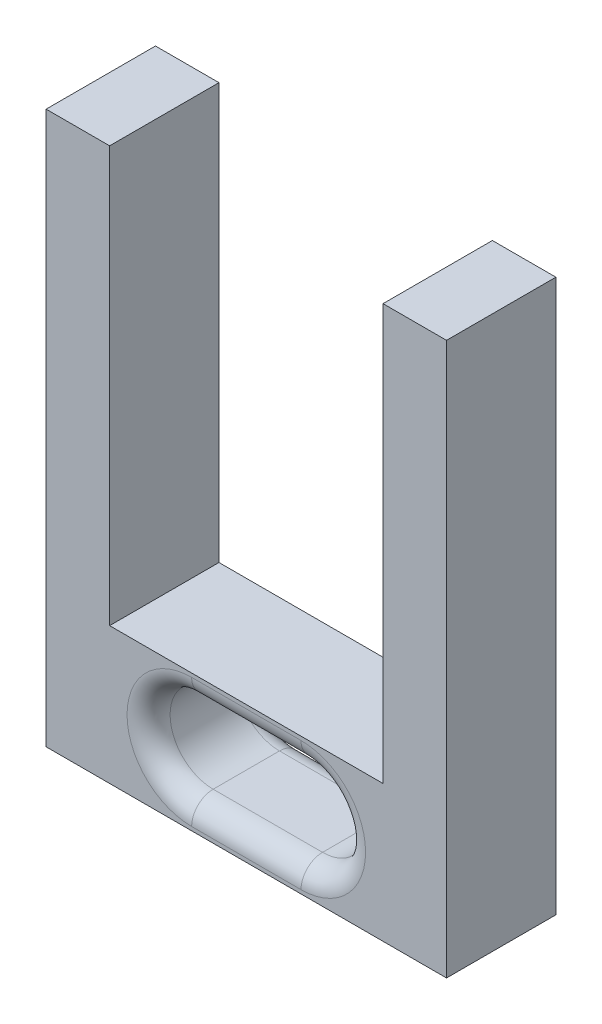
ISO-10303-21;
HEADER;
FILE_DESCRIPTION(('STEP AP214'),'2;1');
FILE_NAME('part.step','',(''),(''),'','','');
FILE_SCHEMA(('AUTOMOTIVE_DESIGN { 1 0 10303 214 1 1 1 1 }'));
ENDSEC;
DATA;
#1=APPLICATION_CONTEXT('core data for automotive mechanical design processes');
#2=APPLICATION_PROTOCOL_DEFINITION('international standard','automotive_design',2000,#1);
#3=PRODUCT_CONTEXT('',#1,'mechanical');
#4=PRODUCT('Part','Part','',(#3));
#5=PRODUCT_RELATED_PRODUCT_CATEGORY('part','',(#4));
#6=PRODUCT_DEFINITION_FORMATION('','',#4);
#7=PRODUCT_DEFINITION_CONTEXT('part definition',#1,'design');
#8=PRODUCT_DEFINITION('design','',#6,#7);
#9=PRODUCT_DEFINITION_SHAPE('','',#8);
#10=(LENGTH_UNIT() NAMED_UNIT(*) SI_UNIT(.MILLI.,.METRE.));
#11=(NAMED_UNIT(*) PLANE_ANGLE_UNIT() SI_UNIT($,.RADIAN.));
#12=(NAMED_UNIT(*) SI_UNIT($,.STERADIAN.) SOLID_ANGLE_UNIT());
#13=UNCERTAINTY_MEASURE_WITH_UNIT(LENGTH_MEASURE(1.E-05),#10,'distance_accuracy_value','');
#14=(GEOMETRIC_REPRESENTATION_CONTEXT(3) GLOBAL_UNCERTAINTY_ASSIGNED_CONTEXT((#13)) GLOBAL_UNIT_ASSIGNED_CONTEXT((#10,
#11,#12)) REPRESENTATION_CONTEXT('',''));
#15=CARTESIAN_POINT('',(0.,0.,0.));
#16=DIRECTION('',(0.,0.,1.));
#17=DIRECTION('',(1.,0.,0.));
#18=AXIS2_PLACEMENT_3D('',#15,#16,#17);
#19=CARTESIAN_POINT('',(0.,0.,25.4));
#20=DIRECTION('',(0.,0.,1.));
#21=DIRECTION('',(1.,0.,0.));
#22=AXIS2_PLACEMENT_3D('',#19,#20,#21);
#23=PLANE('',#22);
#24=DIRECTION('',(1.,0.,0.));
#25=VECTOR('',#24,1.);
#26=CARTESIAN_POINT('',(0.,-127.395,25.4));
#27=LINE('',#26,#25);
#28=CARTESIAN_POINT('',(12.7,-127.395,25.4));
#29=VERTEX_POINT('',#28);
#30=CARTESIAN_POINT('',(-12.7,-127.395,25.4));
#31=VERTEX_POINT('',#30);
#32=EDGE_CURVE('E201',#29,#31,#27,.F.);
#33=ORIENTED_EDGE('',*,*,#32,.T.);
#34=CARTESIAN_POINT('',(-12.7,-112.395,25.4));
#35=DIRECTION('',(0.,0.,1.));
#36=DIRECTION('',(1.,0.,0.));
#37=AXIS2_PLACEMENT_3D('',#34,#35,#36);
#38=CIRCLE('',#37,15.);
#39=CARTESIAN_POINT('',(-12.7,-97.395,25.4));
#40=VERTEX_POINT('',#39);
#41=EDGE_CURVE('E206',#31,#40,#38,.F.);
#42=ORIENTED_EDGE('',*,*,#41,.T.);
#43=DIRECTION('',(-1.,0.,0.));
#44=VECTOR('',#43,1.);
#45=CARTESIAN_POINT('',(0.,-97.395,25.4));
#46=LINE('',#45,#44);
#47=CARTESIAN_POINT('',(12.7,-97.395,25.4));
#48=VERTEX_POINT('',#47);
#49=EDGE_CURVE('E57',#40,#48,#46,.F.);
#50=ORIENTED_EDGE('',*,*,#49,.T.);
#51=CARTESIAN_POINT('',(12.7,-112.395,25.4));
#52=DIRECTION('',(0.,0.,1.));
#53=DIRECTION('',(1.,0.,0.));
#54=AXIS2_PLACEMENT_3D('',#51,#52,#53);
#55=CIRCLE('',#54,15.);
#56=EDGE_CURVE('E203',#48,#29,#55,.F.);
#57=ORIENTED_EDGE('',*,*,#56,.T.);
#58=EDGE_LOOP('',(#33,#42,#50,#57));
#59=FACE_BOUND('',#58,.T.);
#60=DIRECTION('',(0.,-1.,0.));
#61=VECTOR('',#60,1.);
#62=CARTESIAN_POINT('',(-46.5,0.,25.4));
#63=LINE('',#62,#61);
#64=CARTESIAN_POINT('',(-46.5,0.,25.4));
#65=VERTEX_POINT('',#64);
#66=CARTESIAN_POINT('',(-46.5,-128.27,25.4));
#67=VERTEX_POINT('',#66);
#68=EDGE_CURVE('E160',#65,#67,#63,.T.);
#69=ORIENTED_EDGE('',*,*,#68,.T.);
#70=DIRECTION('',(1.,0.,0.));
#71=VECTOR('',#70,1.);
#72=CARTESIAN_POINT('',(-46.5,-128.27,25.4));
#73=LINE('',#72,#71);
#74=CARTESIAN_POINT('',(46.5,-128.27,25.4));
#75=VERTEX_POINT('',#74);
#76=EDGE_CURVE('E149',#67,#75,#73,.T.);
#77=ORIENTED_EDGE('',*,*,#76,.T.);
#78=DIRECTION('',(0.,1.,0.));
#79=VECTOR('',#78,1.);
#80=CARTESIAN_POINT('',(46.5,-128.27,25.4));
#81=LINE('',#80,#79);
#82=CARTESIAN_POINT('',(46.5,0.,25.4));
#83=VERTEX_POINT('',#82);
#84=EDGE_CURVE('E159',#75,#83,#81,.T.);
#85=ORIENTED_EDGE('',*,*,#84,.T.);
#86=DIRECTION('',(-1.,0.,0.));
#87=VECTOR('',#86,1.);
#88=CARTESIAN_POINT('',(46.5,0.,25.4));
#89=LINE('',#88,#87);
#90=CARTESIAN_POINT('',(31.75,0.,25.4));
#91=VERTEX_POINT('',#90);
#92=EDGE_CURVE('E260',#83,#91,#89,.T.);
#93=ORIENTED_EDGE('',*,*,#92,.T.);
#94=DIRECTION('',(0.,-1.,0.));
#95=VECTOR('',#94,1.);
#96=CARTESIAN_POINT('',(31.75,-96.52,25.4));
#97=LINE('',#96,#95);
#98=CARTESIAN_POINT('',(31.75,-96.52,25.4));
#99=VERTEX_POINT('',#98);
#100=EDGE_CURVE('E262',#91,#99,#97,.T.);
#101=ORIENTED_EDGE('',*,*,#100,.T.);
#102=DIRECTION('',(-1.,0.,0.));
#103=VECTOR('',#102,1.);
#104=CARTESIAN_POINT('',(-31.75,-96.52,25.4));
#105=LINE('',#104,#103);
#106=CARTESIAN_POINT('',(-31.75,-96.52,25.4));
#107=VERTEX_POINT('',#106);
#108=EDGE_CURVE('E264',#99,#107,#105,.T.);
#109=ORIENTED_EDGE('',*,*,#108,.T.);
#110=DIRECTION('',(0.,1.,0.));
#111=VECTOR('',#110,1.);
#112=CARTESIAN_POINT('',(-31.75,0.,25.4));
#113=LINE('',#112,#111);
#114=CARTESIAN_POINT('',(-31.75,0.,25.4));
#115=VERTEX_POINT('',#114);
#116=EDGE_CURVE('E266',#107,#115,#113,.T.);
#117=ORIENTED_EDGE('',*,*,#116,.T.);
#118=DIRECTION('',(-1.,0.,0.));
#119=VECTOR('',#118,1.);
#120=CARTESIAN_POINT('',(-46.5,0.,25.4));
#121=LINE('',#120,#119);
#122=EDGE_CURVE('E164',#115,#65,#121,.T.);
#123=ORIENTED_EDGE('',*,*,#122,.T.);
#124=EDGE_LOOP('',(#69,#77,#85,#93,#101,#109,#117,#123));
#125=FACE_BOUND('',#124,.T.);
#126=ADVANCED_FACE('F33',(#59,#125),#23,.T.);
#127=CARTESIAN_POINT('',(0.,0.,0.));
#128=DIRECTION('',(0.,0.,1.));
#129=DIRECTION('',(1.,0.,0.));
#130=AXIS2_PLACEMENT_3D('',#127,#128,#129);
#131=PLANE('',#130);
#132=DIRECTION('',(1.,0.,0.));
#133=VECTOR('',#132,1.);
#134=CARTESIAN_POINT('',(12.7,-127.395,0.));
#135=LINE('',#134,#133);
#136=CARTESIAN_POINT('',(-12.7,-127.395,0.));
#137=VERTEX_POINT('',#136);
#138=CARTESIAN_POINT('',(12.7,-127.395,0.));
#139=VERTEX_POINT('',#138);
#140=EDGE_CURVE('E182',#137,#139,#135,.T.);
#141=ORIENTED_EDGE('',*,*,#140,.T.);
#142=CARTESIAN_POINT('',(12.7,-112.395,0.));
#143=DIRECTION('',(0.,0.,1.));
#144=DIRECTION('',(1.,0.,0.));
#145=AXIS2_PLACEMENT_3D('',#142,#143,#144);
#146=CIRCLE('',#145,15.);
#147=CARTESIAN_POINT('',(12.7,-97.395,0.));
#148=VERTEX_POINT('',#147);
#149=EDGE_CURVE('E184',#139,#148,#146,.T.);
#150=ORIENTED_EDGE('',*,*,#149,.T.);
#151=DIRECTION('',(-1.,0.,0.));
#152=VECTOR('',#151,1.);
#153=CARTESIAN_POINT('',(-12.7,-97.395,0.));
#154=LINE('',#153,#152);
#155=CARTESIAN_POINT('',(-12.7,-97.395,0.));
#156=VERTEX_POINT('',#155);
#157=EDGE_CURVE('E173',#148,#156,#154,.T.);
#158=ORIENTED_EDGE('',*,*,#157,.T.);
#159=CARTESIAN_POINT('',(-12.7,-112.395,0.));
#160=DIRECTION('',(0.,0.,1.));
#161=DIRECTION('',(1.,0.,0.));
#162=AXIS2_PLACEMENT_3D('',#159,#160,#161);
#163=CIRCLE('',#162,15.);
#164=EDGE_CURVE('E175',#156,#137,#163,.T.);
#165=ORIENTED_EDGE('',*,*,#164,.T.);
#166=EDGE_LOOP('',(#141,#150,#158,#165));
#167=FACE_BOUND('',#166,.T.);
#168=DIRECTION('',(0.,-1.,0.));
#169=VECTOR('',#168,1.);
#170=CARTESIAN_POINT('',(-46.5,0.,0.));
#171=LINE('',#170,#169);
#172=CARTESIAN_POINT('',(-46.5,0.,0.));
#173=VERTEX_POINT('',#172);
#174=CARTESIAN_POINT('',(-46.5,-128.27,0.));
#175=VERTEX_POINT('',#174);
#176=EDGE_CURVE('E172',#173,#175,#171,.T.);
#177=ORIENTED_EDGE('',*,*,#176,.F.);
#178=DIRECTION('',(-1.,0.,0.));
#179=VECTOR('',#178,1.);
#180=CARTESIAN_POINT('',(-46.5,0.,0.));
#181=LINE('',#180,#179);
#182=CARTESIAN_POINT('',(-31.75,0.,0.));
#183=VERTEX_POINT('',#182);
#184=EDGE_CURVE('E168',#183,#173,#181,.T.);
#185=ORIENTED_EDGE('',*,*,#184,.F.);
#186=DIRECTION('',(0.,1.,0.));
#187=VECTOR('',#186,1.);
#188=CARTESIAN_POINT('',(-31.75,0.,0.));
#189=LINE('',#188,#187);
#190=CARTESIAN_POINT('',(-31.75,-96.52,0.));
#191=VERTEX_POINT('',#190);
#192=EDGE_CURVE('E279',#191,#183,#189,.T.);
#193=ORIENTED_EDGE('',*,*,#192,.F.);
#194=DIRECTION('',(-1.,0.,0.));
#195=VECTOR('',#194,1.);
#196=CARTESIAN_POINT('',(-31.75,-96.52,0.));
#197=LINE('',#196,#195);
#198=CARTESIAN_POINT('',(31.75,-96.52,0.));
#199=VERTEX_POINT('',#198);
#200=EDGE_CURVE('E277',#199,#191,#197,.T.);
#201=ORIENTED_EDGE('',*,*,#200,.F.);
#202=DIRECTION('',(0.,-1.,0.));
#203=VECTOR('',#202,1.);
#204=CARTESIAN_POINT('',(31.75,-96.52,0.));
#205=LINE('',#204,#203);
#206=CARTESIAN_POINT('',(31.75,0.,0.));
#207=VERTEX_POINT('',#206);
#208=EDGE_CURVE('E275',#207,#199,#205,.T.);
#209=ORIENTED_EDGE('',*,*,#208,.F.);
#210=DIRECTION('',(-1.,0.,0.));
#211=VECTOR('',#210,1.);
#212=CARTESIAN_POINT('',(46.5,0.,0.));
#213=LINE('',#212,#211);
#214=CARTESIAN_POINT('',(46.5,0.,0.));
#215=VERTEX_POINT('',#214);
#216=EDGE_CURVE('E273',#215,#207,#213,.T.);
#217=ORIENTED_EDGE('',*,*,#216,.F.);
#218=DIRECTION('',(0.,1.,0.));
#219=VECTOR('',#218,1.);
#220=CARTESIAN_POINT('',(46.5,-128.27,0.));
#221=LINE('',#220,#219);
#222=CARTESIAN_POINT('',(46.5,-128.27,0.));
#223=VERTEX_POINT('',#222);
#224=EDGE_CURVE('E271',#223,#215,#221,.T.);
#225=ORIENTED_EDGE('',*,*,#224,.F.);
#226=DIRECTION('',(1.,0.,0.));
#227=VECTOR('',#226,1.);
#228=CARTESIAN_POINT('',(-46.5,-128.27,0.));
#229=LINE('',#228,#227);
#230=EDGE_CURVE('E253',#175,#223,#229,.T.);
#231=ORIENTED_EDGE('',*,*,#230,.F.);
#232=EDGE_LOOP('',(#177,#185,#193,#201,#209,#217,#225,#231));
#233=FACE_BOUND('',#232,.T.);
#234=ADVANCED_FACE('F305',(#167,#233),#131,.F.);
#235=CARTESIAN_POINT('',(-46.5,0.,25.4));
#236=DIRECTION('',(1.,0.,0.));
#237=DIRECTION('',(0.,1.,0.));
#238=AXIS2_PLACEMENT_3D('',#235,#236,#237);
#239=PLANE('',#238);
#240=ORIENTED_EDGE('',*,*,#176,.T.);
#241=DIRECTION('',(0.,0.,-1.));
#242=VECTOR('',#241,1.);
#243=CARTESIAN_POINT('',(-46.5,-128.27,25.4));
#244=LINE('',#243,#242);
#245=EDGE_CURVE('E153',#67,#175,#244,.T.);
#246=ORIENTED_EDGE('',*,*,#245,.F.);
#247=ORIENTED_EDGE('',*,*,#68,.F.);
#248=DIRECTION('',(0.,0.,-1.));
#249=VECTOR('',#248,1.);
#250=CARTESIAN_POINT('',(-46.5,0.,25.4));
#251=LINE('',#250,#249);
#252=EDGE_CURVE('E268',#65,#173,#251,.T.);
#253=ORIENTED_EDGE('',*,*,#252,.T.);
#254=EDGE_LOOP('',(#240,#246,#247,#253));
#255=FACE_BOUND('',#254,.T.);
#256=ADVANCED_FACE('F170',(#255),#239,.F.);
#257=CARTESIAN_POINT('',(-46.5,-128.27,25.4));
#258=DIRECTION('',(0.,1.,0.));
#259=DIRECTION('',(-1.,0.,0.));
#260=AXIS2_PLACEMENT_3D('',#257,#258,#259);
#261=PLANE('',#260);
#262=ORIENTED_EDGE('',*,*,#230,.T.);
#263=DIRECTION('',(0.,0.,-1.));
#264=VECTOR('',#263,1.);
#265=CARTESIAN_POINT('',(46.5,-128.27,25.4));
#266=LINE('',#265,#264);
#267=EDGE_CURVE('E156',#75,#223,#266,.T.);
#268=ORIENTED_EDGE('',*,*,#267,.F.);
#269=ORIENTED_EDGE('',*,*,#76,.F.);
#270=ORIENTED_EDGE('',*,*,#245,.T.);
#271=EDGE_LOOP('',(#262,#268,#269,#270));
#272=FACE_BOUND('',#271,.T.);
#273=ADVANCED_FACE('F151',(#272),#261,.F.);
#274=CARTESIAN_POINT('',(46.5,-128.27,25.4));
#275=DIRECTION('',(-1.,0.,0.));
#276=DIRECTION('',(0.,-1.,0.));
#277=AXIS2_PLACEMENT_3D('',#274,#275,#276);
#278=PLANE('',#277);
#279=ORIENTED_EDGE('',*,*,#224,.T.);
#280=DIRECTION('',(0.,0.,-1.));
#281=VECTOR('',#280,1.);
#282=CARTESIAN_POINT('',(46.5,0.,25.4));
#283=LINE('',#282,#281);
#284=EDGE_CURVE('E177',#83,#215,#283,.T.);
#285=ORIENTED_EDGE('',*,*,#284,.F.);
#286=ORIENTED_EDGE('',*,*,#84,.F.);
#287=ORIENTED_EDGE('',*,*,#267,.T.);
#288=EDGE_LOOP('',(#279,#285,#286,#287));
#289=FACE_BOUND('',#288,.T.);
#290=ADVANCED_FACE('F318',(#289),#278,.F.);
#291=CARTESIAN_POINT('',(46.5,0.,25.4));
#292=DIRECTION('',(0.,-1.,0.));
#293=DIRECTION('',(1.,0.,0.));
#294=AXIS2_PLACEMENT_3D('',#291,#292,#293);
#295=PLANE('',#294);
#296=ORIENTED_EDGE('',*,*,#216,.T.);
#297=DIRECTION('',(0.,0.,-1.));
#298=VECTOR('',#297,1.);
#299=CARTESIAN_POINT('',(31.75,0.,25.4));
#300=LINE('',#299,#298);
#301=EDGE_CURVE('E292',#91,#207,#300,.T.);
#302=ORIENTED_EDGE('',*,*,#301,.F.);
#303=ORIENTED_EDGE('',*,*,#92,.F.);
#304=ORIENTED_EDGE('',*,*,#284,.T.);
#305=EDGE_LOOP('',(#296,#302,#303,#304));
#306=FACE_BOUND('',#305,.T.);
#307=ADVANCED_FACE('F299',(#306),#295,.F.);
#308=CARTESIAN_POINT('',(31.75,-96.52,25.4));
#309=DIRECTION('',(1.,0.,0.));
#310=DIRECTION('',(0.,1.,0.));
#311=AXIS2_PLACEMENT_3D('',#308,#309,#310);
#312=PLANE('',#311);
#313=ORIENTED_EDGE('',*,*,#208,.T.);
#314=DIRECTION('',(0.,0.,-1.));
#315=VECTOR('',#314,1.);
#316=CARTESIAN_POINT('',(31.75,-96.52,25.4));
#317=LINE('',#316,#315);
#318=EDGE_CURVE('E289',#99,#199,#317,.T.);
#319=ORIENTED_EDGE('',*,*,#318,.F.);
#320=ORIENTED_EDGE('',*,*,#100,.F.);
#321=ORIENTED_EDGE('',*,*,#301,.T.);
#322=EDGE_LOOP('',(#313,#319,#320,#321));
#323=FACE_BOUND('',#322,.T.);
#324=ADVANCED_FACE('F310',(#323),#312,.F.);
#325=CARTESIAN_POINT('',(-31.75,-96.52,25.4));
#326=DIRECTION('',(0.,-1.,0.));
#327=DIRECTION('',(1.,0.,0.));
#328=AXIS2_PLACEMENT_3D('',#325,#326,#327);
#329=PLANE('',#328);
#330=ORIENTED_EDGE('',*,*,#200,.T.);
#331=DIRECTION('',(0.,0.,-1.));
#332=VECTOR('',#331,1.);
#333=CARTESIAN_POINT('',(-31.75,-96.52,25.4));
#334=LINE('',#333,#332);
#335=EDGE_CURVE('E286',#107,#191,#334,.T.);
#336=ORIENTED_EDGE('',*,*,#335,.F.);
#337=ORIENTED_EDGE('',*,*,#108,.F.);
#338=ORIENTED_EDGE('',*,*,#318,.T.);
#339=EDGE_LOOP('',(#330,#336,#337,#338));
#340=FACE_BOUND('',#339,.T.);
#341=ADVANCED_FACE('F314',(#340),#329,.F.);
#342=CARTESIAN_POINT('',(-31.75,0.,25.4));
#343=DIRECTION('',(-1.,0.,0.));
#344=DIRECTION('',(0.,-1.,0.));
#345=AXIS2_PLACEMENT_3D('',#342,#343,#344);
#346=PLANE('',#345);
#347=ORIENTED_EDGE('',*,*,#192,.T.);
#348=DIRECTION('',(0.,0.,-1.));
#349=VECTOR('',#348,1.);
#350=CARTESIAN_POINT('',(-31.75,0.,25.4));
#351=LINE('',#350,#349);
#352=EDGE_CURVE('E283',#115,#183,#351,.T.);
#353=ORIENTED_EDGE('',*,*,#352,.F.);
#354=ORIENTED_EDGE('',*,*,#116,.F.);
#355=ORIENTED_EDGE('',*,*,#335,.T.);
#356=EDGE_LOOP('',(#347,#353,#354,#355));
#357=FACE_BOUND('',#356,.T.);
#358=ADVANCED_FACE('F340',(#357),#346,.F.);
#359=CARTESIAN_POINT('',(-46.5,0.,25.4));
#360=DIRECTION('',(0.,-1.,0.));
#361=DIRECTION('',(1.,0.,0.));
#362=AXIS2_PLACEMENT_3D('',#359,#360,#361);
#363=PLANE('',#362);
#364=ORIENTED_EDGE('',*,*,#184,.T.);
#365=ORIENTED_EDGE('',*,*,#252,.F.);
#366=ORIENTED_EDGE('',*,*,#122,.F.);
#367=ORIENTED_EDGE('',*,*,#352,.T.);
#368=EDGE_LOOP('',(#364,#365,#366,#367));
#369=FACE_BOUND('',#368,.T.);
#370=ADVANCED_FACE('F337',(#369),#363,.F.);
#371=CARTESIAN_POINT('',(-12.7,-112.395,25.4));
#372=DIRECTION('',(0.,0.,-1.));
#373=DIRECTION('',(-1.,0.,0.));
#374=AXIS2_PLACEMENT_3D('',#371,#372,#373);
#375=CYLINDRICAL_SURFACE('',#374,9.99999999999999);
#376=DIRECTION('',(0.,0.,-1.));
#377=VECTOR('',#376,1.);
#378=CARTESIAN_POINT('',(-12.7,-122.395,25.4));
#379=LINE('',#378,#377);
#380=CARTESIAN_POINT('',(-12.7,-122.395,20.4));
#381=VERTEX_POINT('',#380);
#382=CARTESIAN_POINT('',(-12.7,-122.395,5.));
#383=VERTEX_POINT('',#382);
#384=EDGE_CURVE('E246',#381,#383,#379,.T.);
#385=ORIENTED_EDGE('',*,*,#384,.T.);
#386=CARTESIAN_POINT('',(-12.7,-112.395,5.));
#387=DIRECTION('',(0.,0.,1.));
#388=DIRECTION('',(1.,0.,0.));
#389=AXIS2_PLACEMENT_3D('',#386,#387,#388);
#390=CIRCLE('',#389,9.99999999999999);
#391=CARTESIAN_POINT('',(-12.7,-102.395,5.));
#392=VERTEX_POINT('',#391);
#393=EDGE_CURVE('E199',#383,#392,#390,.F.);
#394=ORIENTED_EDGE('',*,*,#393,.T.);
#395=DIRECTION('',(0.,0.,-1.));
#396=VECTOR('',#395,1.);
#397=CARTESIAN_POINT('',(-12.7,-102.395,25.4));
#398=LINE('',#397,#396);
#399=CARTESIAN_POINT('',(-12.7,-102.395,20.4));
#400=VERTEX_POINT('',#399);
#401=EDGE_CURVE('E219',#400,#392,#398,.T.);
#402=ORIENTED_EDGE('',*,*,#401,.F.);
#403=CARTESIAN_POINT('',(-12.7,-112.395,20.4));
#404=DIRECTION('',(0.,0.,1.));
#405=DIRECTION('',(1.,0.,0.));
#406=AXIS2_PLACEMENT_3D('',#403,#404,#405);
#407=CIRCLE('',#406,9.99999999999999);
#408=EDGE_CURVE('E196',#400,#381,#407,.T.);
#409=ORIENTED_EDGE('',*,*,#408,.T.);
#410=EDGE_LOOP('',(#385,#394,#402,#409));
#411=FACE_BOUND('',#410,.T.);
#412=ADVANCED_FACE('F245',(#411),#375,.F.);
#413=CARTESIAN_POINT('',(-12.7,-122.395,25.4));
#414=DIRECTION('',(0.,1.,0.));
#415=DIRECTION('',(0.,0.,1.));
#416=AXIS2_PLACEMENT_3D('',#413,#414,#415);
#417=PLANE('',#416);
#418=DIRECTION('',(0.,0.,-1.));
#419=VECTOR('',#418,1.);
#420=CARTESIAN_POINT('',(12.7,-122.395,25.4));
#421=LINE('',#420,#419);
#422=CARTESIAN_POINT('',(12.7,-122.395,20.4));
#423=VERTEX_POINT('',#422);
#424=CARTESIAN_POINT('',(12.7,-122.395,5.));
#425=VERTEX_POINT('',#424);
#426=EDGE_CURVE('E251',#423,#425,#421,.T.);
#427=ORIENTED_EDGE('',*,*,#426,.T.);
#428=DIRECTION('',(1.,0.,0.));
#429=VECTOR('',#428,1.);
#430=CARTESIAN_POINT('',(-12.7,-122.395,5.));
#431=LINE('',#430,#429);
#432=EDGE_CURVE('E194',#425,#383,#431,.F.);
#433=ORIENTED_EDGE('',*,*,#432,.T.);
#434=ORIENTED_EDGE('',*,*,#384,.F.);
#435=DIRECTION('',(1.,0.,0.));
#436=VECTOR('',#435,1.);
#437=CARTESIAN_POINT('',(-12.7,-122.395,20.4));
#438=LINE('',#437,#436);
#439=EDGE_CURVE('E192',#381,#423,#438,.T.);
#440=ORIENTED_EDGE('',*,*,#439,.T.);
#441=EDGE_LOOP('',(#427,#433,#434,#440));
#442=FACE_BOUND('',#441,.T.);
#443=ADVANCED_FACE('F249',(#442),#417,.T.);
#444=CARTESIAN_POINT('',(12.7,-112.395,25.4));
#445=DIRECTION('',(0.,0.,-1.));
#446=DIRECTION('',(-1.,0.,0.));
#447=AXIS2_PLACEMENT_3D('',#444,#445,#446);
#448=CYLINDRICAL_SURFACE('',#447,9.99999999999999);
#449=DIRECTION('',(0.,0.,-1.));
#450=VECTOR('',#449,1.);
#451=CARTESIAN_POINT('',(12.7,-102.395,25.4));
#452=LINE('',#451,#450);
#453=CARTESIAN_POINT('',(12.7,-102.395,20.4));
#454=VERTEX_POINT('',#453);
#455=CARTESIAN_POINT('',(12.7,-102.395,5.));
#456=VERTEX_POINT('',#455);
#457=EDGE_CURVE('E255',#454,#456,#452,.T.);
#458=ORIENTED_EDGE('',*,*,#457,.T.);
#459=CARTESIAN_POINT('',(12.7,-112.395,5.));
#460=DIRECTION('',(0.,0.,1.));
#461=DIRECTION('',(1.,0.,0.));
#462=AXIS2_PLACEMENT_3D('',#459,#460,#461);
#463=CIRCLE('',#462,9.99999999999999);
#464=EDGE_CURVE('E189',#456,#425,#463,.F.);
#465=ORIENTED_EDGE('',*,*,#464,.T.);
#466=ORIENTED_EDGE('',*,*,#426,.F.);
#467=CARTESIAN_POINT('',(12.7,-112.395,20.4));
#468=DIRECTION('',(0.,0.,1.));
#469=DIRECTION('',(1.,0.,0.));
#470=AXIS2_PLACEMENT_3D('',#467,#468,#469);
#471=CIRCLE('',#470,9.99999999999999);
#472=EDGE_CURVE('E187',#423,#454,#471,.T.);
#473=ORIENTED_EDGE('',*,*,#472,.T.);
#474=EDGE_LOOP('',(#458,#465,#466,#473));
#475=FACE_BOUND('',#474,.T.);
#476=ADVANCED_FACE('F376',(#475),#448,.F.);
#477=CARTESIAN_POINT('',(-12.7,-102.395,25.4));
#478=DIRECTION('',(0.,-1.,0.));
#479=DIRECTION('',(0.,0.,-1.));
#480=AXIS2_PLACEMENT_3D('',#477,#478,#479);
#481=PLANE('',#480);
#482=ORIENTED_EDGE('',*,*,#457,.F.);
#483=DIRECTION('',(-1.,0.,0.));
#484=VECTOR('',#483,1.);
#485=CARTESIAN_POINT('',(-12.7,-102.395,20.4));
#486=LINE('',#485,#484);
#487=EDGE_CURVE('E11',#454,#400,#486,.T.);
#488=ORIENTED_EDGE('',*,*,#487,.T.);
#489=ORIENTED_EDGE('',*,*,#401,.T.);
#490=DIRECTION('',(-1.,0.,0.));
#491=VECTOR('',#490,1.);
#492=CARTESIAN_POINT('',(12.7,-102.395,5.));
#493=LINE('',#492,#491);
#494=EDGE_CURVE('E42',#392,#456,#493,.F.);
#495=ORIENTED_EDGE('',*,*,#494,.T.);
#496=EDGE_LOOP('',(#482,#488,#489,#495));
#497=FACE_BOUND('',#496,.T.);
#498=ADVANCED_FACE('F382',(#497),#481,.T.);
#499=CARTESIAN_POINT('',(-12.7,-112.395,5.));
#500=DIRECTION('',(0.,0.,1.));
#501=DIRECTION('',(1.,0.,0.));
#502=AXIS2_PLACEMENT_3D('',#499,#500,#501);
#503=TOROIDAL_SURFACE('',#502,15.,5.);
#504=CARTESIAN_POINT('',(-12.7,-97.395,5.));
#505=DIRECTION('',(1.,0.,0.));
#506=DIRECTION('',(0.,1.,0.));
#507=AXIS2_PLACEMENT_3D('',#504,#505,#506);
#508=CIRCLE('',#507,5.);
#509=EDGE_CURVE('E213',#392,#156,#508,.T.);
#510=ORIENTED_EDGE('',*,*,#509,.F.);
#511=ORIENTED_EDGE('',*,*,#393,.F.);
#512=CARTESIAN_POINT('',(-12.7,-127.395,5.));
#513=DIRECTION('',(1.,0.,0.));
#514=DIRECTION('',(0.,0.,-1.));
#515=AXIS2_PLACEMENT_3D('',#512,#513,#514);
#516=CIRCLE('',#515,5.);
#517=EDGE_CURVE('E216',#137,#383,#516,.T.);
#518=ORIENTED_EDGE('',*,*,#517,.F.);
#519=ORIENTED_EDGE('',*,*,#164,.F.);
#520=EDGE_LOOP('',(#510,#511,#518,#519));
#521=FACE_BOUND('',#520,.T.);
#522=ADVANCED_FACE('F390',(#521),#503,.T.);
#523=CARTESIAN_POINT('',(0.,-127.395,5.));
#524=DIRECTION('',(-1.,0.,0.));
#525=DIRECTION('',(0.,0.,1.));
#526=AXIS2_PLACEMENT_3D('',#523,#524,#525);
#527=CYLINDRICAL_SURFACE('',#526,5.);
#528=ORIENTED_EDGE('',*,*,#517,.T.);
#529=ORIENTED_EDGE('',*,*,#432,.F.);
#530=CARTESIAN_POINT('',(12.7,-127.395,5.));
#531=DIRECTION('',(1.,0.,0.));
#532=DIRECTION('',(0.,1.,0.));
#533=AXIS2_PLACEMENT_3D('',#530,#531,#532);
#534=CIRCLE('',#533,5.);
#535=EDGE_CURVE('E211',#139,#425,#534,.T.);
#536=ORIENTED_EDGE('',*,*,#535,.F.);
#537=ORIENTED_EDGE('',*,*,#140,.F.);
#538=EDGE_LOOP('',(#528,#529,#536,#537));
#539=FACE_BOUND('',#538,.T.);
#540=ADVANCED_FACE('F398',(#539),#527,.T.);
#541=CARTESIAN_POINT('',(0.,-97.395,5.));
#542=DIRECTION('',(1.,0.,0.));
#543=DIRECTION('',(0.,0.,-1.));
#544=AXIS2_PLACEMENT_3D('',#541,#542,#543);
#545=CYLINDRICAL_SURFACE('',#544,5.);
#546=ORIENTED_EDGE('',*,*,#509,.T.);
#547=ORIENTED_EDGE('',*,*,#157,.F.);
#548=CARTESIAN_POINT('',(12.7,-97.395,5.));
#549=DIRECTION('',(1.,0.,0.));
#550=DIRECTION('',(0.,0.,-1.));
#551=AXIS2_PLACEMENT_3D('',#548,#549,#550);
#552=CIRCLE('',#551,5.);
#553=EDGE_CURVE('E209',#456,#148,#552,.T.);
#554=ORIENTED_EDGE('',*,*,#553,.F.);
#555=ORIENTED_EDGE('',*,*,#494,.F.);
#556=EDGE_LOOP('',(#546,#547,#554,#555));
#557=FACE_BOUND('',#556,.T.);
#558=ADVANCED_FACE('F406',(#557),#545,.T.);
#559=CARTESIAN_POINT('',(12.7,-112.395,5.));
#560=DIRECTION('',(0.,0.,1.));
#561=DIRECTION('',(1.,0.,0.));
#562=AXIS2_PLACEMENT_3D('',#559,#560,#561);
#563=TOROIDAL_SURFACE('',#562,15.,5.);
#564=ORIENTED_EDGE('',*,*,#535,.T.);
#565=ORIENTED_EDGE('',*,*,#464,.F.);
#566=ORIENTED_EDGE('',*,*,#553,.T.);
#567=ORIENTED_EDGE('',*,*,#149,.F.);
#568=EDGE_LOOP('',(#564,#565,#566,#567));
#569=FACE_BOUND('',#568,.T.);
#570=ADVANCED_FACE('F414',(#569),#563,.T.);
#571=CARTESIAN_POINT('',(12.7,-112.395,20.4));
#572=DIRECTION('',(0.,0.,1.));
#573=DIRECTION('',(1.,0.,0.));
#574=AXIS2_PLACEMENT_3D('',#571,#572,#573);
#575=TOROIDAL_SURFACE('',#574,15.,5.);
#576=CARTESIAN_POINT('',(12.7,-127.395,20.4));
#577=DIRECTION('',(-1.,0.,0.));
#578=DIRECTION('',(0.,-1.,0.));
#579=AXIS2_PLACEMENT_3D('',#576,#577,#578);
#580=CIRCLE('',#579,5.);
#581=EDGE_CURVE('E222',#29,#423,#580,.T.);
#582=ORIENTED_EDGE('',*,*,#581,.F.);
#583=ORIENTED_EDGE('',*,*,#56,.F.);
#584=CARTESIAN_POINT('',(12.7,-97.395,20.4));
#585=DIRECTION('',(-1.,0.,0.));
#586=DIRECTION('',(0.,0.,1.));
#587=AXIS2_PLACEMENT_3D('',#584,#585,#586);
#588=CIRCLE('',#587,5.);
#589=EDGE_CURVE('E37',#454,#48,#588,.T.);
#590=ORIENTED_EDGE('',*,*,#589,.F.);
#591=ORIENTED_EDGE('',*,*,#472,.F.);
#592=EDGE_LOOP('',(#582,#583,#590,#591));
#593=FACE_BOUND('',#592,.T.);
#594=ADVANCED_FACE('F35',(#593),#575,.T.);
#595=CARTESIAN_POINT('',(-12.7,-97.395,20.4));
#596=DIRECTION('',(-1.,0.,0.));
#597=DIRECTION('',(0.,0.,1.));
#598=AXIS2_PLACEMENT_3D('',#595,#596,#597);
#599=CYLINDRICAL_SURFACE('',#598,5.);
#600=ORIENTED_EDGE('',*,*,#589,.T.);
#601=ORIENTED_EDGE('',*,*,#49,.F.);
#602=CARTESIAN_POINT('',(-12.7,-97.395,20.4));
#603=DIRECTION('',(-1.,0.,0.));
#604=DIRECTION('',(0.,0.,1.));
#605=AXIS2_PLACEMENT_3D('',#602,#603,#604);
#606=CIRCLE('',#605,5.);
#607=EDGE_CURVE('E50',#400,#40,#606,.T.);
#608=ORIENTED_EDGE('',*,*,#607,.F.);
#609=ORIENTED_EDGE('',*,*,#487,.F.);
#610=EDGE_LOOP('',(#600,#601,#608,#609));
#611=FACE_BOUND('',#610,.T.);
#612=ADVANCED_FACE('F232',(#611),#599,.T.);
#613=CARTESIAN_POINT('',(-12.7,-127.395,20.4));
#614=DIRECTION('',(1.,0.,0.));
#615=DIRECTION('',(0.,0.,-1.));
#616=AXIS2_PLACEMENT_3D('',#613,#614,#615);
#617=CYLINDRICAL_SURFACE('',#616,5.);
#618=ORIENTED_EDGE('',*,*,#581,.T.);
#619=ORIENTED_EDGE('',*,*,#439,.F.);
#620=CARTESIAN_POINT('',(-12.7,-127.395,20.4));
#621=DIRECTION('',(-1.,0.,0.));
#622=DIRECTION('',(0.,-1.,0.));
#623=AXIS2_PLACEMENT_3D('',#620,#621,#622);
#624=CIRCLE('',#623,5.);
#625=EDGE_CURVE('E220',#31,#381,#624,.T.);
#626=ORIENTED_EDGE('',*,*,#625,.F.);
#627=ORIENTED_EDGE('',*,*,#32,.F.);
#628=EDGE_LOOP('',(#618,#619,#626,#627));
#629=FACE_BOUND('',#628,.T.);
#630=ADVANCED_FACE('F237',(#629),#617,.T.);
#631=CARTESIAN_POINT('',(-12.7,-112.395,20.4));
#632=DIRECTION('',(0.,0.,1.));
#633=DIRECTION('',(1.,0.,0.));
#634=AXIS2_PLACEMENT_3D('',#631,#632,#633);
#635=TOROIDAL_SURFACE('',#634,15.,5.);
#636=ORIENTED_EDGE('',*,*,#607,.T.);
#637=ORIENTED_EDGE('',*,*,#41,.F.);
#638=ORIENTED_EDGE('',*,*,#625,.T.);
#639=ORIENTED_EDGE('',*,*,#408,.F.);
#640=EDGE_LOOP('',(#636,#637,#638,#639));
#641=FACE_BOUND('',#640,.T.);
#642=ADVANCED_FACE('F236',(#641),#635,.T.);
#643=CLOSED_SHELL('',(#126,#234,#256,#273,#290,#307,#324,#341,#358,#370,#412,#443,#476,#498,
#522,#540,#558,#570,#594,#612,#630,#642));
#644=MANIFOLD_SOLID_BREP('B2',#643);
#645=ADVANCED_BREP_SHAPE_REPRESENTATION('',(#18,#644),#14);
#646=SHAPE_DEFINITION_REPRESENTATION(#9,#645);
ENDSEC;
END-ISO-10303-21;
